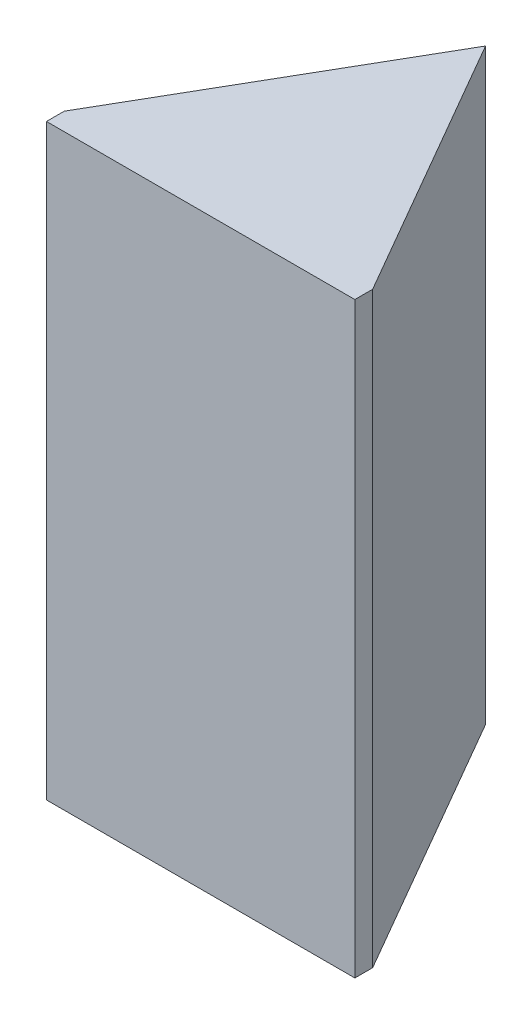
ISO-10303-21;
HEADER;
FILE_DESCRIPTION(('STEP AP214'),'2;1');
FILE_NAME('part.step','',(''),(''),'','','');
FILE_SCHEMA(('AUTOMOTIVE_DESIGN { 1 0 10303 214 1 1 1 1 }'));
ENDSEC;
DATA;
#1=APPLICATION_CONTEXT('core data for automotive mechanical design processes');
#2=APPLICATION_PROTOCOL_DEFINITION('international standard','automotive_design',2000,#1);
#3=PRODUCT_CONTEXT('',#1,'mechanical');
#4=PRODUCT('Part','Part','',(#3));
#5=PRODUCT_RELATED_PRODUCT_CATEGORY('part','',(#4));
#6=PRODUCT_DEFINITION_FORMATION('','',#4);
#7=PRODUCT_DEFINITION_CONTEXT('part definition',#1,'design');
#8=PRODUCT_DEFINITION('design','',#6,#7);
#9=PRODUCT_DEFINITION_SHAPE('','',#8);
#10=(LENGTH_UNIT() NAMED_UNIT(*) SI_UNIT(.MILLI.,.METRE.));
#11=(NAMED_UNIT(*) PLANE_ANGLE_UNIT() SI_UNIT($,.RADIAN.));
#12=(NAMED_UNIT(*) SI_UNIT($,.STERADIAN.) SOLID_ANGLE_UNIT());
#13=UNCERTAINTY_MEASURE_WITH_UNIT(LENGTH_MEASURE(1.E-05),#10,'distance_accuracy_value','');
#14=(GEOMETRIC_REPRESENTATION_CONTEXT(3) GLOBAL_UNCERTAINTY_ASSIGNED_CONTEXT((#13)) GLOBAL_UNIT_ASSIGNED_CONTEXT((#10,
#11,#12)) REPRESENTATION_CONTEXT('',''));
#15=CARTESIAN_POINT('',(0.,0.,0.));
#16=DIRECTION('',(0.,0.,1.));
#17=DIRECTION('',(1.,0.,0.));
#18=AXIS2_PLACEMENT_3D('',#15,#16,#17);
#19=CARTESIAN_POINT('',(25.9807621135333,33.,-14.9999999999999));
#20=DIRECTION('',(-0.866025403784441,0.,0.499999999999995));
#21=DIRECTION('',(0.499999999999995,0.,0.866025403784442));
#22=AXIS2_PLACEMENT_3D('',#19,#20,#21);
#23=PLANE('',#22);
#24=DIRECTION('',(-0.499999999999995,0.,-0.866025403784442));
#25=VECTOR('',#24,1.);
#26=CARTESIAN_POINT('',(25.9807621135333,-33.,-14.9999999999999));
#27=LINE('',#26,#25);
#28=CARTESIAN_POINT('',(34.6410161513775,-33.,0.));
#29=VERTEX_POINT('',#28);
#30=CARTESIAN_POINT('',(17.320508075689,-33.,-30.));
#31=VERTEX_POINT('',#30);
#32=EDGE_CURVE('E112',#29,#31,#27,.T.);
#33=ORIENTED_EDGE('',*,*,#32,.T.);
#34=DIRECTION('',(0.,-1.,0.));
#35=VECTOR('',#34,1.);
#36=CARTESIAN_POINT('',(17.320508075689,33.,-30.));
#37=LINE('',#36,#35);
#38=CARTESIAN_POINT('',(17.320508075689,33.,-30.));
#39=VERTEX_POINT('',#38);
#40=EDGE_CURVE('E11',#39,#31,#37,.T.);
#41=ORIENTED_EDGE('',*,*,#40,.F.);
#42=DIRECTION('',(-0.499999999999995,0.,-0.866025403784442));
#43=VECTOR('',#42,1.);
#44=CARTESIAN_POINT('',(25.9807621135333,33.,-14.9999999999999));
#45=LINE('',#44,#43);
#46=CARTESIAN_POINT('',(34.6410161513775,33.,0.));
#47=VERTEX_POINT('',#46);
#48=EDGE_CURVE('E122',#47,#39,#45,.T.);
#49=ORIENTED_EDGE('',*,*,#48,.F.);
#50=DIRECTION('',(0.,-1.,0.));
#51=VECTOR('',#50,1.);
#52=CARTESIAN_POINT('',(34.6410161513775,33.,0.));
#53=LINE('',#52,#51);
#54=EDGE_CURVE('E53',#47,#29,#53,.T.);
#55=ORIENTED_EDGE('',*,*,#54,.T.);
#56=EDGE_LOOP('',(#33,#41,#49,#55));
#57=FACE_BOUND('',#56,.T.);
#58=ADVANCED_FACE('F37',(#57),#23,.F.);
#59=CARTESIAN_POINT('',(0.,33.,0.));
#60=DIRECTION('',(0.866025403784436,0.,0.500000000000004));
#61=DIRECTION('',(0.500000000000004,0.,-0.866025403784436));
#62=AXIS2_PLACEMENT_3D('',#59,#60,#61);
#63=PLANE('',#62);
#64=DIRECTION('',(-0.500000000000004,0.,0.866025403784436));
#65=VECTOR('',#64,1.);
#66=CARTESIAN_POINT('',(0.,-33.,0.));
#67=LINE('',#66,#65);
#68=CARTESIAN_POINT('',(0.,-33.,0.));
#69=VERTEX_POINT('',#68);
#70=EDGE_CURVE('E114',#31,#69,#67,.T.);
#71=ORIENTED_EDGE('',*,*,#70,.T.);
#72=DIRECTION('',(0.,-1.,0.));
#73=VECTOR('',#72,1.);
#74=CARTESIAN_POINT('',(0.,33.,0.));
#75=LINE('',#74,#73);
#76=CARTESIAN_POINT('',(0.,33.,0.));
#77=VERTEX_POINT('',#76);
#78=EDGE_CURVE('E45',#77,#69,#75,.T.);
#79=ORIENTED_EDGE('',*,*,#78,.F.);
#80=DIRECTION('',(-0.500000000000004,0.,0.866025403784436));
#81=VECTOR('',#80,1.);
#82=CARTESIAN_POINT('',(0.,33.,0.));
#83=LINE('',#82,#81);
#84=EDGE_CURVE('E83',#39,#77,#83,.T.);
#85=ORIENTED_EDGE('',*,*,#84,.F.);
#86=ORIENTED_EDGE('',*,*,#40,.T.);
#87=EDGE_LOOP('',(#71,#79,#85,#86));
#88=FACE_BOUND('',#87,.T.);
#89=ADVANCED_FACE('F137',(#88),#63,.F.);
#90=CARTESIAN_POINT('',(0.,33.,0.));
#91=DIRECTION('',(1.,0.,0.));
#92=DIRECTION('',(0.,0.,-1.));
#93=AXIS2_PLACEMENT_3D('',#90,#91,#92);
#94=PLANE('',#93);
#95=DIRECTION('',(0.,0.,1.));
#96=VECTOR('',#95,1.);
#97=CARTESIAN_POINT('',(0.,-33.,0.));
#98=LINE('',#97,#96);
#99=CARTESIAN_POINT('',(0.,-33.,2.));
#100=VERTEX_POINT('',#99);
#101=EDGE_CURVE('E102',#69,#100,#98,.T.);
#102=ORIENTED_EDGE('',*,*,#101,.T.);
#103=DIRECTION('',(0.,-1.,0.));
#104=VECTOR('',#103,1.);
#105=CARTESIAN_POINT('',(0.,33.,2.));
#106=LINE('',#105,#104);
#107=CARTESIAN_POINT('',(0.,33.,2.));
#108=VERTEX_POINT('',#107);
#109=EDGE_CURVE('E99',#108,#100,#106,.T.);
#110=ORIENTED_EDGE('',*,*,#109,.F.);
#111=DIRECTION('',(0.,0.,1.));
#112=VECTOR('',#111,1.);
#113=CARTESIAN_POINT('',(0.,33.,0.));
#114=LINE('',#113,#112);
#115=EDGE_CURVE('E89',#77,#108,#114,.T.);
#116=ORIENTED_EDGE('',*,*,#115,.F.);
#117=ORIENTED_EDGE('',*,*,#78,.T.);
#118=EDGE_LOOP('',(#102,#110,#116,#117));
#119=FACE_BOUND('',#118,.T.);
#120=ADVANCED_FACE('F100',(#119),#94,.F.);
#121=CARTESIAN_POINT('',(0.,33.,2.));
#122=DIRECTION('',(0.,0.,-1.));
#123=DIRECTION('',(-1.,0.,0.));
#124=AXIS2_PLACEMENT_3D('',#121,#122,#123);
#125=PLANE('',#124);
#126=DIRECTION('',(1.,0.,0.));
#127=VECTOR('',#126,1.);
#128=CARTESIAN_POINT('',(0.,-33.,2.));
#129=LINE('',#128,#127);
#130=CARTESIAN_POINT('',(34.6410161513775,-33.,2.));
#131=VERTEX_POINT('',#130);
#132=EDGE_CURVE('E117',#100,#131,#129,.T.);
#133=ORIENTED_EDGE('',*,*,#132,.T.);
#134=DIRECTION('',(0.,-1.,0.));
#135=VECTOR('',#134,1.);
#136=CARTESIAN_POINT('',(34.6410161513775,33.,2.));
#137=LINE('',#136,#135);
#138=CARTESIAN_POINT('',(34.6410161513775,33.,2.));
#139=VERTEX_POINT('',#138);
#140=EDGE_CURVE('E71',#139,#131,#137,.T.);
#141=ORIENTED_EDGE('',*,*,#140,.F.);
#142=DIRECTION('',(1.,0.,0.));
#143=VECTOR('',#142,1.);
#144=CARTESIAN_POINT('',(0.,33.,2.));
#145=LINE('',#144,#143);
#146=EDGE_CURVE('E94',#108,#139,#145,.T.);
#147=ORIENTED_EDGE('',*,*,#146,.F.);
#148=ORIENTED_EDGE('',*,*,#109,.T.);
#149=EDGE_LOOP('',(#133,#141,#147,#148));
#150=FACE_BOUND('',#149,.T.);
#151=ADVANCED_FACE('F106',(#150),#125,.F.);
#152=CARTESIAN_POINT('',(34.6410161513775,33.,0.));
#153=DIRECTION('',(1.,0.,0.));
#154=DIRECTION('',(0.,0.,-1.));
#155=AXIS2_PLACEMENT_3D('',#152,#153,#154);
#156=PLANE('',#155);
#157=DIRECTION('',(0.,0.,1.));
#158=VECTOR('',#157,1.);
#159=CARTESIAN_POINT('',(34.6410161513775,-33.,0.));
#160=LINE('',#159,#158);
#161=EDGE_CURVE('E119',#29,#131,#160,.T.);
#162=ORIENTED_EDGE('',*,*,#161,.F.);
#163=ORIENTED_EDGE('',*,*,#54,.F.);
#164=DIRECTION('',(0.,0.,1.));
#165=VECTOR('',#164,1.);
#166=CARTESIAN_POINT('',(34.6410161513775,33.,0.));
#167=LINE('',#166,#165);
#168=EDGE_CURVE('E107',#47,#139,#167,.T.);
#169=ORIENTED_EDGE('',*,*,#168,.T.);
#170=ORIENTED_EDGE('',*,*,#140,.T.);
#171=EDGE_LOOP('',(#162,#163,#169,#170));
#172=FACE_BOUND('',#171,.T.);
#173=ADVANCED_FACE('F126',(#172),#156,.T.);
#174=CARTESIAN_POINT('',(0.,33.,0.));
#175=DIRECTION('',(0.,1.,0.));
#176=DIRECTION('',(0.,0.,1.));
#177=AXIS2_PLACEMENT_3D('',#174,#175,#176);
#178=PLANE('',#177);
#179=ORIENTED_EDGE('',*,*,#48,.T.);
#180=ORIENTED_EDGE('',*,*,#84,.T.);
#181=ORIENTED_EDGE('',*,*,#115,.T.);
#182=ORIENTED_EDGE('',*,*,#146,.T.);
#183=ORIENTED_EDGE('',*,*,#168,.F.);
#184=EDGE_LOOP('',(#179,#180,#181,#182,#183));
#185=FACE_BOUND('',#184,.T.);
#186=ADVANCED_FACE('F91',(#185),#178,.T.);
#187=CARTESIAN_POINT('',(0.,-33.,0.));
#188=DIRECTION('',(0.,1.,0.));
#189=DIRECTION('',(0.,0.,1.));
#190=AXIS2_PLACEMENT_3D('',#187,#188,#189);
#191=PLANE('',#190);
#192=ORIENTED_EDGE('',*,*,#32,.F.);
#193=ORIENTED_EDGE('',*,*,#161,.T.);
#194=ORIENTED_EDGE('',*,*,#132,.F.);
#195=ORIENTED_EDGE('',*,*,#101,.F.);
#196=ORIENTED_EDGE('',*,*,#70,.F.);
#197=EDGE_LOOP('',(#192,#193,#194,#195,#196));
#198=FACE_BOUND('',#197,.T.);
#199=ADVANCED_FACE('F125',(#198),#191,.F.);
#200=CLOSED_SHELL('',(#58,#89,#120,#151,#173,#186,#199));
#201=MANIFOLD_SOLID_BREP('B2',#200);
#202=ADVANCED_BREP_SHAPE_REPRESENTATION('',(#18,#201),#14);
#203=SHAPE_DEFINITION_REPRESENTATION(#9,#202);
ENDSEC;
END-ISO-10303-21;
